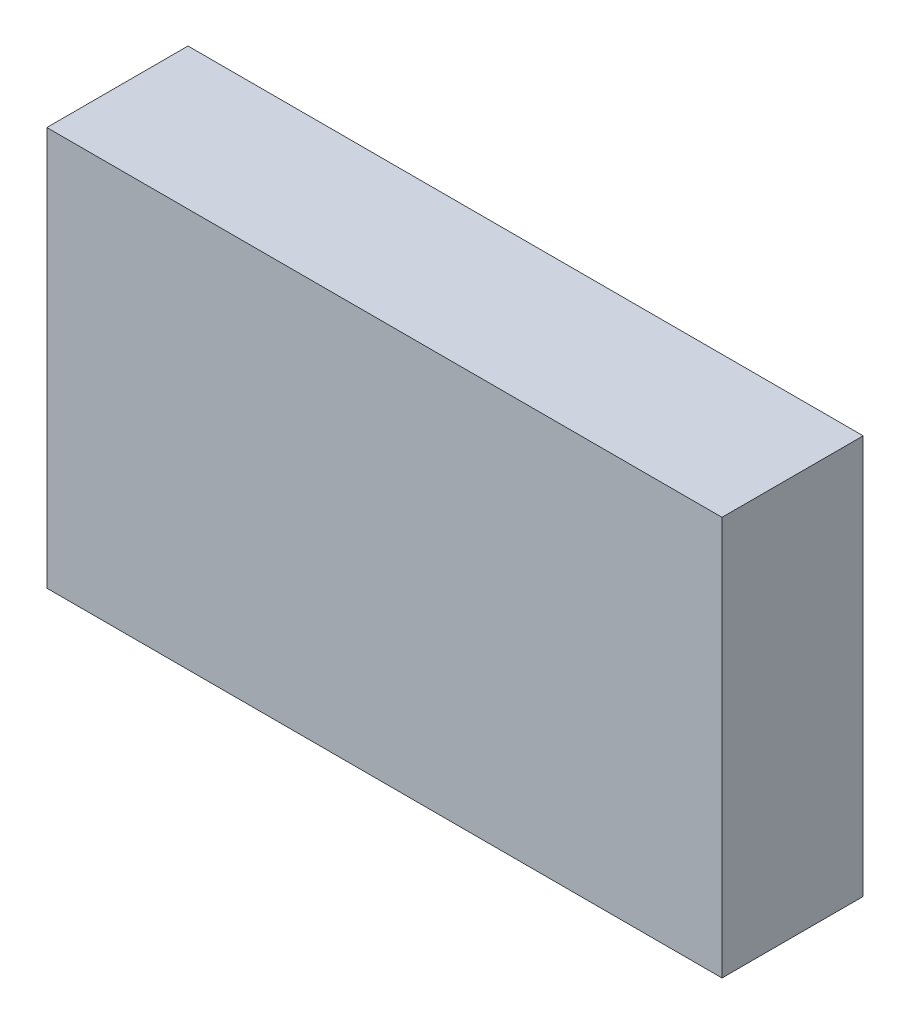
ISO-10303-21;
HEADER;
FILE_DESCRIPTION(('STEP AP214'),'2;1');
FILE_NAME('part.step','',(''),(''),'','','');
FILE_SCHEMA(('AUTOMOTIVE_DESIGN { 1 0 10303 214 1 1 1 1 }'));
ENDSEC;
DATA;
#1=APPLICATION_CONTEXT('core data for automotive mechanical design processes');
#2=APPLICATION_PROTOCOL_DEFINITION('international standard','automotive_design',2000,#1);
#3=PRODUCT_CONTEXT('',#1,'mechanical');
#4=PRODUCT('Part','Part','',(#3));
#5=PRODUCT_RELATED_PRODUCT_CATEGORY('part','',(#4));
#6=PRODUCT_DEFINITION_FORMATION('','',#4);
#7=PRODUCT_DEFINITION_CONTEXT('part definition',#1,'design');
#8=PRODUCT_DEFINITION('design','',#6,#7);
#9=PRODUCT_DEFINITION_SHAPE('','',#8);
#10=(LENGTH_UNIT() NAMED_UNIT(*) SI_UNIT(.MILLI.,.METRE.));
#11=(NAMED_UNIT(*) PLANE_ANGLE_UNIT() SI_UNIT($,.RADIAN.));
#12=(NAMED_UNIT(*) SI_UNIT($,.STERADIAN.) SOLID_ANGLE_UNIT());
#13=UNCERTAINTY_MEASURE_WITH_UNIT(LENGTH_MEASURE(1.E-05),#10,'distance_accuracy_value','');
#14=(GEOMETRIC_REPRESENTATION_CONTEXT(3) GLOBAL_UNCERTAINTY_ASSIGNED_CONTEXT((#13)) GLOBAL_UNIT_ASSIGNED_CONTEXT((#10,
#11,#12)) REPRESENTATION_CONTEXT('',''));
#15=CARTESIAN_POINT('',(0.,0.,0.));
#16=DIRECTION('',(0.,0.,1.));
#17=DIRECTION('',(1.,0.,0.));
#18=AXIS2_PLACEMENT_3D('',#15,#16,#17);
#19=CARTESIAN_POINT('',(0.,0.,23.));
#20=DIRECTION('',(1.,0.,0.));
#21=DIRECTION('',(0.,0.,-1.));
#22=AXIS2_PLACEMENT_3D('',#19,#20,#21);
#23=PLANE('',#22);
#24=DIRECTION('',(0.,-1.,0.));
#25=VECTOR('',#24,1.);
#26=CARTESIAN_POINT('',(0.,0.,0.));
#27=LINE('',#26,#25);
#28=CARTESIAN_POINT('',(0.,65.,0.));
#29=VERTEX_POINT('',#28);
#30=CARTESIAN_POINT('',(0.,0.,0.));
#31=VERTEX_POINT('',#30);
#32=EDGE_CURVE('E100',#29,#31,#27,.T.);
#33=ORIENTED_EDGE('',*,*,#32,.T.);
#34=DIRECTION('',(0.,0.,-1.));
#35=VECTOR('',#34,1.);
#36=CARTESIAN_POINT('',(0.,0.,23.));
#37=LINE('',#36,#35);
#38=CARTESIAN_POINT('',(0.,0.,23.));
#39=VERTEX_POINT('',#38);
#40=EDGE_CURVE('E11',#39,#31,#37,.T.);
#41=ORIENTED_EDGE('',*,*,#40,.F.);
#42=DIRECTION('',(0.,-1.,0.));
#43=VECTOR('',#42,1.);
#44=CARTESIAN_POINT('',(0.,0.,23.));
#45=LINE('',#44,#43);
#46=CARTESIAN_POINT('',(0.,65.,23.));
#47=VERTEX_POINT('',#46);
#48=EDGE_CURVE('E88',#47,#39,#45,.T.);
#49=ORIENTED_EDGE('',*,*,#48,.F.);
#50=DIRECTION('',(0.,0.,-1.));
#51=VECTOR('',#50,1.);
#52=CARTESIAN_POINT('',(0.,65.,23.));
#53=LINE('',#52,#51);
#54=EDGE_CURVE('E96',#47,#29,#53,.T.);
#55=ORIENTED_EDGE('',*,*,#54,.T.);
#56=EDGE_LOOP('',(#33,#41,#49,#55));
#57=FACE_BOUND('',#56,.T.);
#58=ADVANCED_FACE('F37',(#57),#23,.F.);
#59=CARTESIAN_POINT('',(0.,0.,23.));
#60=DIRECTION('',(0.,1.,0.));
#61=DIRECTION('',(0.,0.,1.));
#62=AXIS2_PLACEMENT_3D('',#59,#60,#61);
#63=PLANE('',#62);
#64=DIRECTION('',(1.,0.,0.));
#65=VECTOR('',#64,1.);
#66=CARTESIAN_POINT('',(0.,0.,0.));
#67=LINE('',#66,#65);
#68=CARTESIAN_POINT('',(110.,0.,0.));
#69=VERTEX_POINT('',#68);
#70=EDGE_CURVE('E92',#31,#69,#67,.T.);
#71=ORIENTED_EDGE('',*,*,#70,.T.);
#72=DIRECTION('',(0.,0.,-1.));
#73=VECTOR('',#72,1.);
#74=CARTESIAN_POINT('',(110.,0.,23.));
#75=LINE('',#74,#73);
#76=CARTESIAN_POINT('',(110.,0.,23.));
#77=VERTEX_POINT('',#76);
#78=EDGE_CURVE('E45',#77,#69,#75,.T.);
#79=ORIENTED_EDGE('',*,*,#78,.F.);
#80=DIRECTION('',(1.,0.,0.));
#81=VECTOR('',#80,1.);
#82=CARTESIAN_POINT('',(0.,0.,23.));
#83=LINE('',#82,#81);
#84=EDGE_CURVE('E83',#39,#77,#83,.T.);
#85=ORIENTED_EDGE('',*,*,#84,.F.);
#86=ORIENTED_EDGE('',*,*,#40,.T.);
#87=EDGE_LOOP('',(#71,#79,#85,#86));
#88=FACE_BOUND('',#87,.T.);
#89=ADVANCED_FACE('F91',(#88),#63,.F.);
#90=CARTESIAN_POINT('',(110.,0.,23.));
#91=DIRECTION('',(-1.,0.,0.));
#92=DIRECTION('',(0.,0.,1.));
#93=AXIS2_PLACEMENT_3D('',#90,#91,#92);
#94=PLANE('',#93);
#95=DIRECTION('',(0.,1.,0.));
#96=VECTOR('',#95,1.);
#97=CARTESIAN_POINT('',(110.,0.,0.));
#98=LINE('',#97,#96);
#99=CARTESIAN_POINT('',(110.,65.,0.));
#100=VERTEX_POINT('',#99);
#101=EDGE_CURVE('E70',#69,#100,#98,.T.);
#102=ORIENTED_EDGE('',*,*,#101,.T.);
#103=DIRECTION('',(0.,0.,-1.));
#104=VECTOR('',#103,1.);
#105=CARTESIAN_POINT('',(110.,65.,23.));
#106=LINE('',#105,#104);
#107=CARTESIAN_POINT('',(110.,65.,23.));
#108=VERTEX_POINT('',#107);
#109=EDGE_CURVE('E93',#108,#100,#106,.T.);
#110=ORIENTED_EDGE('',*,*,#109,.F.);
#111=DIRECTION('',(0.,1.,0.));
#112=VECTOR('',#111,1.);
#113=CARTESIAN_POINT('',(110.,0.,23.));
#114=LINE('',#113,#112);
#115=EDGE_CURVE('E86',#77,#108,#114,.T.);
#116=ORIENTED_EDGE('',*,*,#115,.F.);
#117=ORIENTED_EDGE('',*,*,#78,.T.);
#118=EDGE_LOOP('',(#102,#110,#116,#117));
#119=FACE_BOUND('',#118,.T.);
#120=ADVANCED_FACE('F94',(#119),#94,.F.);
#121=CARTESIAN_POINT('',(0.,65.,23.));
#122=DIRECTION('',(0.,-1.,0.));
#123=DIRECTION('',(0.,0.,-1.));
#124=AXIS2_PLACEMENT_3D('',#121,#122,#123);
#125=PLANE('',#124);
#126=DIRECTION('',(-1.,0.,0.));
#127=VECTOR('',#126,1.);
#128=CARTESIAN_POINT('',(0.,65.,0.));
#129=LINE('',#128,#127);
#130=EDGE_CURVE('E76',#100,#29,#129,.T.);
#131=ORIENTED_EDGE('',*,*,#130,.T.);
#132=ORIENTED_EDGE('',*,*,#54,.F.);
#133=DIRECTION('',(-1.,0.,0.));
#134=VECTOR('',#133,1.);
#135=CARTESIAN_POINT('',(0.,65.,23.));
#136=LINE('',#135,#134);
#137=EDGE_CURVE('E53',#108,#47,#136,.T.);
#138=ORIENTED_EDGE('',*,*,#137,.F.);
#139=ORIENTED_EDGE('',*,*,#109,.T.);
#140=EDGE_LOOP('',(#131,#132,#138,#139));
#141=FACE_BOUND('',#140,.T.);
#142=ADVANCED_FACE('F107',(#141),#125,.F.);
#143=CARTESIAN_POINT('',(0.,0.,23.));
#144=DIRECTION('',(0.,0.,-1.));
#145=DIRECTION('',(-1.,0.,0.));
#146=AXIS2_PLACEMENT_3D('',#143,#144,#145);
#147=PLANE('',#146);
#148=ORIENTED_EDGE('',*,*,#48,.T.);
#149=ORIENTED_EDGE('',*,*,#84,.T.);
#150=ORIENTED_EDGE('',*,*,#115,.T.);
#151=ORIENTED_EDGE('',*,*,#137,.T.);
#152=EDGE_LOOP('',(#148,#149,#150,#151));
#153=FACE_BOUND('',#152,.T.);
#154=ADVANCED_FACE('F84',(#153),#147,.F.);
#155=CARTESIAN_POINT('',(0.,0.,0.));
#156=DIRECTION('',(0.,0.,-1.));
#157=DIRECTION('',(-1.,0.,0.));
#158=AXIS2_PLACEMENT_3D('',#155,#156,#157);
#159=PLANE('',#158);
#160=ORIENTED_EDGE('',*,*,#32,.F.);
#161=ORIENTED_EDGE('',*,*,#130,.F.);
#162=ORIENTED_EDGE('',*,*,#101,.F.);
#163=ORIENTED_EDGE('',*,*,#70,.F.);
#164=EDGE_LOOP('',(#160,#161,#162,#163));
#165=FACE_BOUND('',#164,.T.);
#166=ADVANCED_FACE('F110',(#165),#159,.T.);
#167=CLOSED_SHELL('',(#58,#89,#120,#142,#154,#166));
#168=MANIFOLD_SOLID_BREP('B2',#167);
#169=ADVANCED_BREP_SHAPE_REPRESENTATION('',(#18,#168),#14);
#170=SHAPE_DEFINITION_REPRESENTATION(#9,#169);
ENDSEC;
END-ISO-10303-21;
